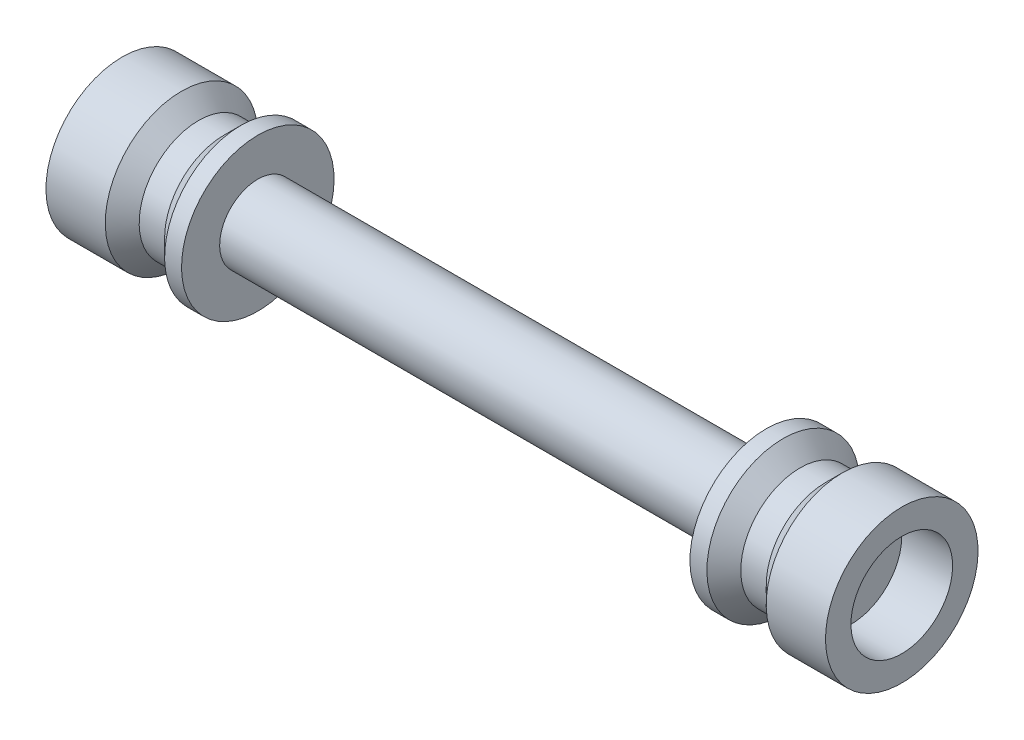
ISO-10303-21;
HEADER;
FILE_DESCRIPTION(('STEP AP214'),'2;1');
FILE_NAME('part.step','',(''),(''),'','','');
FILE_SCHEMA(('AUTOMOTIVE_DESIGN { 1 0 10303 214 1 1 1 1 }'));
ENDSEC;
DATA;
#1=APPLICATION_CONTEXT('core data for automotive mechanical design processes');
#2=APPLICATION_PROTOCOL_DEFINITION('international standard','automotive_design',2000,#1);
#3=PRODUCT_CONTEXT('',#1,'mechanical');
#4=PRODUCT('Part','Part','',(#3));
#5=PRODUCT_RELATED_PRODUCT_CATEGORY('part','',(#4));
#6=PRODUCT_DEFINITION_FORMATION('','',#4);
#7=PRODUCT_DEFINITION_CONTEXT('part definition',#1,'design');
#8=PRODUCT_DEFINITION('design','',#6,#7);
#9=PRODUCT_DEFINITION_SHAPE('','',#8);
#10=(LENGTH_UNIT() NAMED_UNIT(*) SI_UNIT(.MILLI.,.METRE.));
#11=(NAMED_UNIT(*) PLANE_ANGLE_UNIT() SI_UNIT($,.RADIAN.));
#12=(NAMED_UNIT(*) SI_UNIT($,.STERADIAN.) SOLID_ANGLE_UNIT());
#13=UNCERTAINTY_MEASURE_WITH_UNIT(LENGTH_MEASURE(1.E-05),#10,'distance_accuracy_value','');
#14=(GEOMETRIC_REPRESENTATION_CONTEXT(3) GLOBAL_UNCERTAINTY_ASSIGNED_CONTEXT((#13)) GLOBAL_UNIT_ASSIGNED_CONTEXT((#10,
#11,#12)) REPRESENTATION_CONTEXT('',''));
#15=CARTESIAN_POINT('',(0.,0.,0.));
#16=DIRECTION('',(0.,0.,1.));
#17=DIRECTION('',(1.,0.,0.));
#18=AXIS2_PLACEMENT_3D('',#15,#16,#17);
#19=CARTESIAN_POINT('',(20.,0.,0.));
#20=DIRECTION('',(1.,0.,0.));
#21=DIRECTION('',(0.,1.,0.));
#22=AXIS2_PLACEMENT_3D('',#19,#20,#21);
#23=PLANE('',#22);
#24=CARTESIAN_POINT('',(20.,0.,0.));
#25=DIRECTION('',(1.,0.,0.));
#26=DIRECTION('',(0.,1.,0.));
#27=AXIS2_PLACEMENT_3D('',#24,#25,#26);
#28=CIRCLE('',#27,2.99999999999999);
#29=CARTESIAN_POINT('',(20.,2.99999999999999,0.));
#30=VERTEX_POINT('',#29);
#31=EDGE_CURVE('E10',#30,#30,#28,.T.);
#32=ORIENTED_EDGE('',*,*,#31,.T.);
#33=EDGE_LOOP('',(#32));
#34=FACE_BOUND('',#33,.T.);
#35=ADVANCED_FACE('F32',(#34),#23,.T.);
#36=CARTESIAN_POINT('',(0.,0.,0.));
#37=DIRECTION('',(1.,0.,0.));
#38=DIRECTION('',(0.,1.,0.));
#39=AXIS2_PLACEMENT_3D('',#36,#37,#38);
#40=CYLINDRICAL_SURFACE('',#39,2.99999999999999);
#41=CARTESIAN_POINT('',(23.,0.,0.));
#42=DIRECTION('',(1.,0.,0.));
#43=DIRECTION('',(0.,1.,0.));
#44=AXIS2_PLACEMENT_3D('',#41,#42,#43);
#45=CIRCLE('',#44,2.99999999999999);
#46=CARTESIAN_POINT('',(23.,2.99999999999999,0.));
#47=VERTEX_POINT('',#46);
#48=EDGE_CURVE('E38',#47,#47,#45,.T.);
#49=ORIENTED_EDGE('',*,*,#48,.T.);
#50=EDGE_LOOP('',(#49));
#51=FACE_BOUND('',#50,.T.);
#52=ORIENTED_EDGE('',*,*,#31,.F.);
#53=EDGE_LOOP('',(#52));
#54=FACE_BOUND('',#53,.T.);
#55=ADVANCED_FACE('F106',(#51,#54),#40,.F.);
#56=CARTESIAN_POINT('',(23.,2.99999999999999,0.));
#57=DIRECTION('',(1.,0.,0.));
#58=DIRECTION('',(0.,1.,0.));
#59=AXIS2_PLACEMENT_3D('',#56,#57,#58);
#60=PLANE('',#59);
#61=CARTESIAN_POINT('',(23.,0.,0.));
#62=DIRECTION('',(1.,0.,0.));
#63=DIRECTION('',(0.,1.,0.));
#64=AXIS2_PLACEMENT_3D('',#61,#62,#63);
#65=CIRCLE('',#64,4.49999999999999);
#66=CARTESIAN_POINT('',(23.,4.49999999999999,0.));
#67=VERTEX_POINT('',#66);
#68=EDGE_CURVE('E42',#67,#67,#65,.T.);
#69=ORIENTED_EDGE('',*,*,#68,.T.);
#70=EDGE_LOOP('',(#69));
#71=FACE_BOUND('',#70,.T.);
#72=ORIENTED_EDGE('',*,*,#48,.F.);
#73=EDGE_LOOP('',(#72));
#74=FACE_BOUND('',#73,.T.);
#75=ADVANCED_FACE('F110',(#71,#74),#60,.T.);
#76=CARTESIAN_POINT('',(0.,0.,0.));
#77=DIRECTION('',(1.,0.,0.));
#78=DIRECTION('',(0.,1.,0.));
#79=AXIS2_PLACEMENT_3D('',#76,#77,#78);
#80=CYLINDRICAL_SURFACE('',#79,4.49999999999999);
#81=CARTESIAN_POINT('',(19.5,0.,0.));
#82=DIRECTION('',(1.,0.,0.));
#83=DIRECTION('',(0.,1.,0.));
#84=AXIS2_PLACEMENT_3D('',#81,#82,#83);
#85=CIRCLE('',#84,4.49999999999999);
#86=CARTESIAN_POINT('',(19.5,4.49999999999999,0.));
#87=VERTEX_POINT('',#86);
#88=EDGE_CURVE('E46',#87,#87,#85,.T.);
#89=ORIENTED_EDGE('',*,*,#88,.T.);
#90=EDGE_LOOP('',(#89));
#91=FACE_BOUND('',#90,.T.);
#92=ORIENTED_EDGE('',*,*,#68,.F.);
#93=EDGE_LOOP('',(#92));
#94=FACE_BOUND('',#93,.T.);
#95=ADVANCED_FACE('F114',(#91,#94),#80,.T.);
#96=CARTESIAN_POINT('',(19.5,0.,0.));
#97=DIRECTION('',(1.,0.,0.));
#98=DIRECTION('',(0.,1.,0.));
#99=AXIS2_PLACEMENT_3D('',#96,#97,#98);
#100=CONICAL_SURFACE('',#99,4.49999999999999,0.785398163397443);
#101=CARTESIAN_POINT('',(18.5,0.,0.));
#102=DIRECTION('',(1.,0.,0.));
#103=DIRECTION('',(0.,1.,0.));
#104=AXIS2_PLACEMENT_3D('',#101,#102,#103);
#105=CIRCLE('',#104,3.5);
#106=CARTESIAN_POINT('',(18.5,3.5,0.));
#107=VERTEX_POINT('',#106);
#108=EDGE_CURVE('E51',#107,#107,#105,.T.);
#109=ORIENTED_EDGE('',*,*,#108,.T.);
#110=EDGE_LOOP('',(#109));
#111=FACE_BOUND('',#110,.T.);
#112=ORIENTED_EDGE('',*,*,#88,.F.);
#113=EDGE_LOOP('',(#112));
#114=FACE_BOUND('',#113,.T.);
#115=ADVANCED_FACE('F121',(#111,#114),#100,.T.);
#116=CARTESIAN_POINT('',(0.,0.,0.));
#117=DIRECTION('',(1.,0.,0.));
#118=DIRECTION('',(0.,1.,0.));
#119=AXIS2_PLACEMENT_3D('',#116,#117,#118);
#120=CYLINDRICAL_SURFACE('',#119,3.5);
#121=CARTESIAN_POINT('',(17.,0.,0.));
#122=DIRECTION('',(1.,0.,0.));
#123=DIRECTION('',(0.,1.,0.));
#124=AXIS2_PLACEMENT_3D('',#121,#122,#123);
#125=CIRCLE('',#124,3.5);
#126=CARTESIAN_POINT('',(17.,3.5,0.));
#127=VERTEX_POINT('',#126);
#128=EDGE_CURVE('E54',#127,#127,#125,.T.);
#129=ORIENTED_EDGE('',*,*,#128,.T.);
#130=EDGE_LOOP('',(#129));
#131=FACE_BOUND('',#130,.T.);
#132=ORIENTED_EDGE('',*,*,#108,.F.);
#133=EDGE_LOOP('',(#132));
#134=FACE_BOUND('',#133,.T.);
#135=ADVANCED_FACE('F125',(#131,#134),#120,.T.);
#136=CARTESIAN_POINT('',(17.,0.,0.));
#137=DIRECTION('',(-1.,0.,0.));
#138=DIRECTION('',(0.,-1.,0.));
#139=AXIS2_PLACEMENT_3D('',#136,#137,#138);
#140=CONICAL_SURFACE('',#139,3.5,0.78539816339745);
#141=CARTESIAN_POINT('',(16.,0.,0.));
#142=DIRECTION('',(1.,0.,0.));
#143=DIRECTION('',(0.,1.,0.));
#144=AXIS2_PLACEMENT_3D('',#141,#142,#143);
#145=CIRCLE('',#144,4.5);
#146=CARTESIAN_POINT('',(16.,4.5,0.));
#147=VERTEX_POINT('',#146);
#148=EDGE_CURVE('E57',#147,#147,#145,.T.);
#149=ORIENTED_EDGE('',*,*,#148,.T.);
#150=EDGE_LOOP('',(#149));
#151=FACE_BOUND('',#150,.T.);
#152=ORIENTED_EDGE('',*,*,#128,.F.);
#153=EDGE_LOOP('',(#152));
#154=FACE_BOUND('',#153,.T.);
#155=ADVANCED_FACE('F129',(#151,#154),#140,.T.);
#156=CARTESIAN_POINT('',(0.,0.,0.));
#157=DIRECTION('',(1.,0.,0.));
#158=DIRECTION('',(0.,1.,0.));
#159=AXIS2_PLACEMENT_3D('',#156,#157,#158);
#160=CYLINDRICAL_SURFACE('',#159,4.5);
#161=CARTESIAN_POINT('',(15.,0.,0.));
#162=DIRECTION('',(1.,0.,0.));
#163=DIRECTION('',(0.,1.,0.));
#164=AXIS2_PLACEMENT_3D('',#161,#162,#163);
#165=CIRCLE('',#164,4.5);
#166=CARTESIAN_POINT('',(15.,4.5,0.));
#167=VERTEX_POINT('',#166);
#168=EDGE_CURVE('E60',#167,#167,#165,.T.);
#169=ORIENTED_EDGE('',*,*,#168,.T.);
#170=EDGE_LOOP('',(#169));
#171=FACE_BOUND('',#170,.T.);
#172=ORIENTED_EDGE('',*,*,#148,.F.);
#173=EDGE_LOOP('',(#172));
#174=FACE_BOUND('',#173,.T.);
#175=ADVANCED_FACE('F133',(#171,#174),#160,.T.);
#176=CARTESIAN_POINT('',(15.,4.5,0.));
#177=DIRECTION('',(-1.,0.,0.));
#178=DIRECTION('',(0.,-1.,0.));
#179=AXIS2_PLACEMENT_3D('',#176,#177,#178);
#180=PLANE('',#179);
#181=CARTESIAN_POINT('',(15.,0.,0.));
#182=DIRECTION('',(1.,0.,0.));
#183=DIRECTION('',(0.,1.,0.));
#184=AXIS2_PLACEMENT_3D('',#181,#182,#183);
#185=CIRCLE('',#184,2.25);
#186=CARTESIAN_POINT('',(15.,2.25,0.));
#187=VERTEX_POINT('',#186);
#188=EDGE_CURVE('E63',#187,#187,#185,.T.);
#189=ORIENTED_EDGE('',*,*,#188,.T.);
#190=EDGE_LOOP('',(#189));
#191=FACE_BOUND('',#190,.T.);
#192=ORIENTED_EDGE('',*,*,#168,.F.);
#193=EDGE_LOOP('',(#192));
#194=FACE_BOUND('',#193,.T.);
#195=ADVANCED_FACE('F137',(#191,#194),#180,.T.);
#196=CARTESIAN_POINT('',(0.,0.,0.));
#197=DIRECTION('',(1.,0.,0.));
#198=DIRECTION('',(0.,1.,0.));
#199=AXIS2_PLACEMENT_3D('',#196,#197,#198);
#200=CYLINDRICAL_SURFACE('',#199,2.25);
#201=CARTESIAN_POINT('',(-15.,0.,0.));
#202=DIRECTION('',(1.,0.,0.));
#203=DIRECTION('',(0.,1.,0.));
#204=AXIS2_PLACEMENT_3D('',#201,#202,#203);
#205=CIRCLE('',#204,2.25);
#206=CARTESIAN_POINT('',(-15.,2.25,0.));
#207=VERTEX_POINT('',#206);
#208=EDGE_CURVE('E66',#207,#207,#205,.T.);
#209=ORIENTED_EDGE('',*,*,#208,.T.);
#210=EDGE_LOOP('',(#209));
#211=FACE_BOUND('',#210,.T.);
#212=ORIENTED_EDGE('',*,*,#188,.F.);
#213=EDGE_LOOP('',(#212));
#214=FACE_BOUND('',#213,.T.);
#215=ADVANCED_FACE('F141',(#211,#214),#200,.T.);
#216=CARTESIAN_POINT('',(-15.,4.5,0.));
#217=DIRECTION('',(1.,0.,0.));
#218=DIRECTION('',(0.,1.,0.));
#219=AXIS2_PLACEMENT_3D('',#216,#217,#218);
#220=PLANE('',#219);
#221=CARTESIAN_POINT('',(-15.,0.,0.));
#222=DIRECTION('',(1.,0.,0.));
#223=DIRECTION('',(0.,1.,0.));
#224=AXIS2_PLACEMENT_3D('',#221,#222,#223);
#225=CIRCLE('',#224,4.5);
#226=CARTESIAN_POINT('',(-15.,4.5,0.));
#227=VERTEX_POINT('',#226);
#228=EDGE_CURVE('E69',#227,#227,#225,.T.);
#229=ORIENTED_EDGE('',*,*,#228,.T.);
#230=EDGE_LOOP('',(#229));
#231=FACE_BOUND('',#230,.T.);
#232=ORIENTED_EDGE('',*,*,#208,.F.);
#233=EDGE_LOOP('',(#232));
#234=FACE_BOUND('',#233,.T.);
#235=ADVANCED_FACE('F145',(#231,#234),#220,.T.);
#236=CARTESIAN_POINT('',(0.,0.,0.));
#237=DIRECTION('',(1.,0.,0.));
#238=DIRECTION('',(0.,1.,0.));
#239=AXIS2_PLACEMENT_3D('',#236,#237,#238);
#240=CYLINDRICAL_SURFACE('',#239,4.5);
#241=CARTESIAN_POINT('',(-16.,0.,0.));
#242=DIRECTION('',(1.,0.,0.));
#243=DIRECTION('',(0.,1.,0.));
#244=AXIS2_PLACEMENT_3D('',#241,#242,#243);
#245=CIRCLE('',#244,4.5);
#246=CARTESIAN_POINT('',(-16.,4.5,0.));
#247=VERTEX_POINT('',#246);
#248=EDGE_CURVE('E72',#247,#247,#245,.T.);
#249=ORIENTED_EDGE('',*,*,#248,.T.);
#250=EDGE_LOOP('',(#249));
#251=FACE_BOUND('',#250,.T.);
#252=ORIENTED_EDGE('',*,*,#228,.F.);
#253=EDGE_LOOP('',(#252));
#254=FACE_BOUND('',#253,.T.);
#255=ADVANCED_FACE('F149',(#251,#254),#240,.T.);
#256=CARTESIAN_POINT('',(-16.,0.,0.));
#257=DIRECTION('',(1.,0.,0.));
#258=DIRECTION('',(0.,1.,0.));
#259=AXIS2_PLACEMENT_3D('',#256,#257,#258);
#260=CONICAL_SURFACE('',#259,4.5,0.785398163397449);
#261=CARTESIAN_POINT('',(-17.,0.,0.));
#262=DIRECTION('',(1.,0.,0.));
#263=DIRECTION('',(0.,1.,0.));
#264=AXIS2_PLACEMENT_3D('',#261,#262,#263);
#265=CIRCLE('',#264,3.5);
#266=CARTESIAN_POINT('',(-17.,3.5,0.));
#267=VERTEX_POINT('',#266);
#268=EDGE_CURVE('E75',#267,#267,#265,.T.);
#269=ORIENTED_EDGE('',*,*,#268,.T.);
#270=EDGE_LOOP('',(#269));
#271=FACE_BOUND('',#270,.T.);
#272=ORIENTED_EDGE('',*,*,#248,.F.);
#273=EDGE_LOOP('',(#272));
#274=FACE_BOUND('',#273,.T.);
#275=ADVANCED_FACE('F153',(#271,#274),#260,.T.);
#276=CARTESIAN_POINT('',(0.,0.,0.));
#277=DIRECTION('',(1.,0.,0.));
#278=DIRECTION('',(0.,1.,0.));
#279=AXIS2_PLACEMENT_3D('',#276,#277,#278);
#280=CYLINDRICAL_SURFACE('',#279,3.5);
#281=CARTESIAN_POINT('',(-18.5,0.,0.));
#282=DIRECTION('',(1.,0.,0.));
#283=DIRECTION('',(0.,1.,0.));
#284=AXIS2_PLACEMENT_3D('',#281,#282,#283);
#285=CIRCLE('',#284,3.5);
#286=CARTESIAN_POINT('',(-18.5,3.5,0.));
#287=VERTEX_POINT('',#286);
#288=EDGE_CURVE('E78',#287,#287,#285,.T.);
#289=ORIENTED_EDGE('',*,*,#288,.T.);
#290=EDGE_LOOP('',(#289));
#291=FACE_BOUND('',#290,.T.);
#292=ORIENTED_EDGE('',*,*,#268,.F.);
#293=EDGE_LOOP('',(#292));
#294=FACE_BOUND('',#293,.T.);
#295=ADVANCED_FACE('F157',(#291,#294),#280,.T.);
#296=CARTESIAN_POINT('',(-18.5,0.,0.));
#297=DIRECTION('',(-1.,0.,0.));
#298=DIRECTION('',(0.,-1.,0.));
#299=AXIS2_PLACEMENT_3D('',#296,#297,#298);
#300=CONICAL_SURFACE('',#299,3.5,0.785398163397446);
#301=CARTESIAN_POINT('',(-19.5,0.,0.));
#302=DIRECTION('',(1.,0.,0.));
#303=DIRECTION('',(0.,1.,0.));
#304=AXIS2_PLACEMENT_3D('',#301,#302,#303);
#305=CIRCLE('',#304,4.5);
#306=CARTESIAN_POINT('',(-19.5,4.49999999999999,0.));
#307=VERTEX_POINT('',#306);
#308=EDGE_CURVE('E81',#307,#307,#305,.T.);
#309=ORIENTED_EDGE('',*,*,#308,.T.);
#310=EDGE_LOOP('',(#309));
#311=FACE_BOUND('',#310,.T.);
#312=ORIENTED_EDGE('',*,*,#288,.F.);
#313=EDGE_LOOP('',(#312));
#314=FACE_BOUND('',#313,.T.);
#315=ADVANCED_FACE('F161',(#311,#314),#300,.T.);
#316=CARTESIAN_POINT('',(0.,0.,0.));
#317=DIRECTION('',(1.,0.,0.));
#318=DIRECTION('',(0.,1.,0.));
#319=AXIS2_PLACEMENT_3D('',#316,#317,#318);
#320=CYLINDRICAL_SURFACE('',#319,4.5);
#321=CARTESIAN_POINT('',(-23.,0.,0.));
#322=DIRECTION('',(1.,0.,0.));
#323=DIRECTION('',(0.,1.,0.));
#324=AXIS2_PLACEMENT_3D('',#321,#322,#323);
#325=CIRCLE('',#324,4.49999999999999);
#326=CARTESIAN_POINT('',(-23.,4.49999999999999,0.));
#327=VERTEX_POINT('',#326);
#328=EDGE_CURVE('E84',#327,#327,#325,.T.);
#329=ORIENTED_EDGE('',*,*,#328,.T.);
#330=EDGE_LOOP('',(#329));
#331=FACE_BOUND('',#330,.T.);
#332=ORIENTED_EDGE('',*,*,#308,.F.);
#333=EDGE_LOOP('',(#332));
#334=FACE_BOUND('',#333,.T.);
#335=ADVANCED_FACE('F165',(#331,#334),#320,.T.);
#336=CARTESIAN_POINT('',(-23.,2.99999999999999,0.));
#337=DIRECTION('',(-1.,0.,0.));
#338=DIRECTION('',(0.,-1.,0.));
#339=AXIS2_PLACEMENT_3D('',#336,#337,#338);
#340=PLANE('',#339);
#341=CARTESIAN_POINT('',(-23.,0.,0.));
#342=DIRECTION('',(1.,0.,0.));
#343=DIRECTION('',(0.,1.,0.));
#344=AXIS2_PLACEMENT_3D('',#341,#342,#343);
#345=CIRCLE('',#344,2.99999999999999);
#346=CARTESIAN_POINT('',(-23.,2.99999999999999,0.));
#347=VERTEX_POINT('',#346);
#348=EDGE_CURVE('E87',#347,#347,#345,.T.);
#349=ORIENTED_EDGE('',*,*,#348,.T.);
#350=EDGE_LOOP('',(#349));
#351=FACE_BOUND('',#350,.T.);
#352=ORIENTED_EDGE('',*,*,#328,.F.);
#353=EDGE_LOOP('',(#352));
#354=FACE_BOUND('',#353,.T.);
#355=ADVANCED_FACE('F103',(#351,#354),#340,.T.);
#356=CARTESIAN_POINT('',(0.,0.,0.));
#357=DIRECTION('',(1.,0.,0.));
#358=DIRECTION('',(0.,1.,0.));
#359=AXIS2_PLACEMENT_3D('',#356,#357,#358);
#360=CYLINDRICAL_SURFACE('',#359,2.99999999999999);
#361=CARTESIAN_POINT('',(-20.,0.,0.));
#362=DIRECTION('',(1.,0.,0.));
#363=DIRECTION('',(0.,1.,0.));
#364=AXIS2_PLACEMENT_3D('',#361,#362,#363);
#365=CIRCLE('',#364,3.);
#366=CARTESIAN_POINT('',(-20.,2.99999999999999,0.));
#367=VERTEX_POINT('',#366);
#368=EDGE_CURVE('E90',#367,#367,#365,.T.);
#369=ORIENTED_EDGE('',*,*,#368,.T.);
#370=EDGE_LOOP('',(#369));
#371=FACE_BOUND('',#370,.T.);
#372=ORIENTED_EDGE('',*,*,#348,.F.);
#373=EDGE_LOOP('',(#372));
#374=FACE_BOUND('',#373,.T.);
#375=ADVANCED_FACE('F94',(#371,#374),#360,.F.);
#376=CARTESIAN_POINT('',(-20.,0.,0.));
#377=DIRECTION('',(-1.,0.,0.));
#378=DIRECTION('',(0.,-1.,0.));
#379=AXIS2_PLACEMENT_3D('',#376,#377,#378);
#380=PLANE('',#379);
#381=ORIENTED_EDGE('',*,*,#368,.F.);
#382=EDGE_LOOP('',(#381));
#383=FACE_BOUND('',#382,.T.);
#384=ADVANCED_FACE('F97',(#383),#380,.T.);
#385=CLOSED_SHELL('',(#35,#55,#75,#95,#115,#135,#155,#175,#195,#215,#235,#255,#275,#295,#315,
#335,#355,#375,#384));
#386=MANIFOLD_SOLID_BREP('B2',#385);
#387=ADVANCED_BREP_SHAPE_REPRESENTATION('',(#18,#386),#14);
#388=SHAPE_DEFINITION_REPRESENTATION(#9,#387);
ENDSEC;
END-ISO-10303-21;
